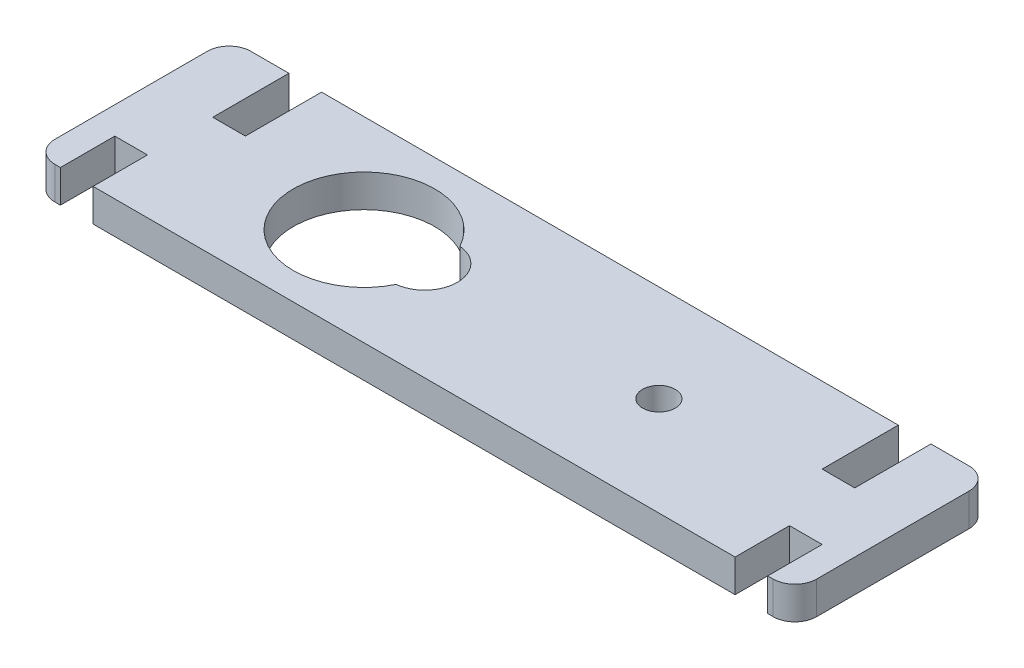
ISO-10303-21;
HEADER;
FILE_DESCRIPTION(('STEP AP214'),'2;1');
FILE_NAME('part.step','',(''),(''),'','','');
FILE_SCHEMA(('AUTOMOTIVE_DESIGN { 1 0 10303 214 1 1 1 1 }'));
ENDSEC;
DATA;
#1=APPLICATION_CONTEXT('core data for automotive mechanical design processes');
#2=APPLICATION_PROTOCOL_DEFINITION('international standard','automotive_design',2000,#1);
#3=PRODUCT_CONTEXT('',#1,'mechanical');
#4=PRODUCT('Part','Part','',(#3));
#5=PRODUCT_RELATED_PRODUCT_CATEGORY('part','',(#4));
#6=PRODUCT_DEFINITION_FORMATION('','',#4);
#7=PRODUCT_DEFINITION_CONTEXT('part definition',#1,'design');
#8=PRODUCT_DEFINITION('design','',#6,#7);
#9=PRODUCT_DEFINITION_SHAPE('','',#8);
#10=(LENGTH_UNIT() NAMED_UNIT(*) SI_UNIT(.MILLI.,.METRE.));
#11=(NAMED_UNIT(*) PLANE_ANGLE_UNIT() SI_UNIT($,.RADIAN.));
#12=(NAMED_UNIT(*) SI_UNIT($,.STERADIAN.) SOLID_ANGLE_UNIT());
#13=UNCERTAINTY_MEASURE_WITH_UNIT(LENGTH_MEASURE(1.E-05),#10,'distance_accuracy_value','');
#14=(GEOMETRIC_REPRESENTATION_CONTEXT(3) GLOBAL_UNCERTAINTY_ASSIGNED_CONTEXT((#13)) GLOBAL_UNIT_ASSIGNED_CONTEXT((#10,
#11,#12)) REPRESENTATION_CONTEXT('',''));
#15=CARTESIAN_POINT('',(0.,0.,0.));
#16=DIRECTION('',(0.,0.,1.));
#17=DIRECTION('',(1.,0.,0.));
#18=AXIS2_PLACEMENT_3D('',#15,#16,#17);
#19=CARTESIAN_POINT('',(62.4161145926589,3.,2.12292688749626));
#20=DIRECTION('',(0.,0.,-1.));
#21=DIRECTION('',(-1.,0.,0.));
#22=AXIS2_PLACEMENT_3D('',#19,#20,#21);
#23=PLANE('',#22);
#24=DIRECTION('',(1.,0.,0.));
#25=VECTOR('',#24,1.);
#26=CARTESIAN_POINT('',(62.4161145926589,0.,2.12292688749626));
#27=LINE('',#26,#25);
#28=CARTESIAN_POINT('',(-0.0838854073410972,0.,2.12292688749627));
#29=VERTEX_POINT('',#28);
#30=CARTESIAN_POINT('',(58.9161145926589,0.,2.12292688749627));
#31=VERTEX_POINT('',#30);
#32=EDGE_CURVE('E233',#29,#31,#27,.T.);
#33=ORIENTED_EDGE('',*,*,#32,.T.);
#34=DIRECTION('',(0.,1.,0.));
#35=VECTOR('',#34,1.);
#36=CARTESIAN_POINT('',(58.9161145926589,0.,2.12292688749627));
#37=LINE('',#36,#35);
#38=CARTESIAN_POINT('',(58.9161145926589,3.,2.12292688749627));
#39=VERTEX_POINT('',#38);
#40=EDGE_CURVE('E216',#31,#39,#37,.T.);
#41=ORIENTED_EDGE('',*,*,#40,.T.);
#42=DIRECTION('',(1.,0.,0.));
#43=VECTOR('',#42,1.);
#44=CARTESIAN_POINT('',(62.4161145926589,3.,2.12292688749626));
#45=LINE('',#44,#43);
#46=CARTESIAN_POINT('',(-0.0838854073410972,3.,2.12292688749627));
#47=VERTEX_POINT('',#46);
#48=EDGE_CURVE('E319',#47,#39,#45,.T.);
#49=ORIENTED_EDGE('',*,*,#48,.F.);
#50=DIRECTION('',(0.,1.,0.));
#51=VECTOR('',#50,1.);
#52=CARTESIAN_POINT('',(-0.0838854073410972,0.,2.12292688749627));
#53=LINE('',#52,#51);
#54=EDGE_CURVE('E239',#29,#47,#53,.T.);
#55=ORIENTED_EDGE('',*,*,#54,.F.);
#56=EDGE_LOOP('',(#33,#41,#49,#55));
#57=FACE_BOUND('',#56,.T.);
#58=ADVANCED_FACE('F43',(#57),#23,.F.);
#59=CARTESIAN_POINT('',(61.9161145926589,3.,2.12292688749627));
#60=VERTEX_POINT('',#59);
#61=CARTESIAN_POINT('',(62.4161145926589,3.,2.12292688749626));
#62=VERTEX_POINT('',#61);
#63=EDGE_CURVE('E314',#60,#62,#45,.T.);
#64=ORIENTED_EDGE('',*,*,#63,.F.);
#65=DIRECTION('',(0.,1.,0.));
#66=VECTOR('',#65,1.);
#67=CARTESIAN_POINT('',(61.9161145926589,0.,2.12292688749627));
#68=LINE('',#67,#66);
#69=CARTESIAN_POINT('',(61.9161145926589,0.,2.12292688749627));
#70=VERTEX_POINT('',#69);
#71=EDGE_CURVE('E226',#70,#60,#68,.T.);
#72=ORIENTED_EDGE('',*,*,#71,.F.);
#73=CARTESIAN_POINT('',(62.4161145926589,0.,2.12292688749626));
#74=VERTEX_POINT('',#73);
#75=EDGE_CURVE('E241',#70,#74,#27,.T.);
#76=ORIENTED_EDGE('',*,*,#75,.T.);
#77=DIRECTION('',(0.,-1.,0.));
#78=VECTOR('',#77,1.);
#79=CARTESIAN_POINT('',(62.4161145926589,3.,2.12292688749626));
#80=LINE('',#79,#78);
#81=EDGE_CURVE('E273',#62,#74,#80,.T.);
#82=ORIENTED_EDGE('',*,*,#81,.F.);
#83=EDGE_LOOP('',(#64,#72,#76,#82));
#84=FACE_BOUND('',#83,.T.);
#85=ADVANCED_FACE('F433',(#84),#23,.F.);
#86=CARTESIAN_POINT('',(-3.58388540734109,3.,-15.8770731125037));
#87=DIRECTION('',(0.,0.,1.));
#88=DIRECTION('',(1.,0.,0.));
#89=AXIS2_PLACEMENT_3D('',#86,#87,#88);
#90=PLANE('',#89);
#91=DIRECTION('',(-1.,0.,0.));
#92=VECTOR('',#91,1.);
#93=CARTESIAN_POINT('',(-3.58388540734109,3.,-15.8770731125037));
#94=LINE('',#93,#92);
#95=CARTESIAN_POINT('',(-0.0838854073410972,3.,-15.8770731125037));
#96=VERTEX_POINT('',#95);
#97=CARTESIAN_POINT('',(-3.58388540734109,3.,-15.8770731125037));
#98=VERTEX_POINT('',#97);
#99=EDGE_CURVE('E325',#96,#98,#94,.T.);
#100=ORIENTED_EDGE('',*,*,#99,.F.);
#101=DIRECTION('',(0.,1.,0.));
#102=VECTOR('',#101,1.);
#103=CARTESIAN_POINT('',(-0.0838854073410972,0.,-15.8770731125037));
#104=LINE('',#103,#102);
#105=CARTESIAN_POINT('',(-0.0838854073410972,0.,-15.8770731125037));
#106=VERTEX_POINT('',#105);
#107=EDGE_CURVE('E374',#106,#96,#104,.T.);
#108=ORIENTED_EDGE('',*,*,#107,.F.);
#109=DIRECTION('',(-1.,0.,0.));
#110=VECTOR('',#109,1.);
#111=CARTESIAN_POINT('',(-3.58388540734109,0.,-15.8770731125037));
#112=LINE('',#111,#110);
#113=CARTESIAN_POINT('',(-3.58388540734109,0.,-15.8770731125037));
#114=VERTEX_POINT('',#113);
#115=EDGE_CURVE('E254',#106,#114,#112,.T.);
#116=ORIENTED_EDGE('',*,*,#115,.T.);
#117=DIRECTION('',(0.,-1.,0.));
#118=VECTOR('',#117,1.);
#119=CARTESIAN_POINT('',(-3.58388540734109,3.,-15.8770731125037));
#120=LINE('',#119,#118);
#121=EDGE_CURVE('E260',#98,#114,#120,.T.);
#122=ORIENTED_EDGE('',*,*,#121,.F.);
#123=EDGE_LOOP('',(#100,#108,#116,#122));
#124=FACE_BOUND('',#123,.T.);
#125=ADVANCED_FACE('F439',(#124),#90,.F.);
#126=CARTESIAN_POINT('',(55.9161145926589,0.,-15.8770731125037));
#127=VERTEX_POINT('',#126);
#128=CARTESIAN_POINT('',(2.91611459265891,0.,-15.8770731125037));
#129=VERTEX_POINT('',#128);
#130=EDGE_CURVE('E259',#127,#129,#112,.T.);
#131=ORIENTED_EDGE('',*,*,#130,.T.);
#132=DIRECTION('',(0.,1.,0.));
#133=VECTOR('',#132,1.);
#134=CARTESIAN_POINT('',(2.91611459265891,0.,-15.8770731125037));
#135=LINE('',#134,#133);
#136=CARTESIAN_POINT('',(2.91611459265891,3.,-15.8770731125037));
#137=VERTEX_POINT('',#136);
#138=EDGE_CURVE('E376',#129,#137,#135,.T.);
#139=ORIENTED_EDGE('',*,*,#138,.T.);
#140=CARTESIAN_POINT('',(55.9161145926589,3.,-15.8770731125037));
#141=VERTEX_POINT('',#140);
#142=EDGE_CURVE('E327',#141,#137,#94,.T.);
#143=ORIENTED_EDGE('',*,*,#142,.F.);
#144=DIRECTION('',(0.,1.,0.));
#145=VECTOR('',#144,1.);
#146=CARTESIAN_POINT('',(55.9161145926589,0.,-15.8770731125037));
#147=LINE('',#146,#145);
#148=EDGE_CURVE('E390',#127,#141,#147,.T.);
#149=ORIENTED_EDGE('',*,*,#148,.F.);
#150=EDGE_LOOP('',(#131,#139,#143,#149));
#151=FACE_BOUND('',#150,.T.);
#152=ADVANCED_FACE('F459',(#151),#90,.F.);
#153=CARTESIAN_POINT('',(-3.58388540734109,3.,-13.8770731125037));
#154=DIRECTION('',(0.,-1.,0.));
#155=DIRECTION('',(0.,0.,-1.));
#156=AXIS2_PLACEMENT_3D('',#153,#154,#155);
#157=CYLINDRICAL_SURFACE('',#156,2.);
#158=CARTESIAN_POINT('',(-3.58388540734109,0.,-13.8770731125037));
#159=DIRECTION('',(0.,1.,0.));
#160=DIRECTION('',(0.,0.,-1.));
#161=AXIS2_PLACEMENT_3D('',#158,#159,#160);
#162=CIRCLE('',#161,2.);
#163=CARTESIAN_POINT('',(-5.58388540734109,0.,-13.8770731125037));
#164=VERTEX_POINT('',#163);
#165=EDGE_CURVE('E298',#114,#164,#162,.T.);
#166=ORIENTED_EDGE('',*,*,#165,.T.);
#167=DIRECTION('',(0.,-1.,0.));
#168=VECTOR('',#167,1.);
#169=CARTESIAN_POINT('',(-5.58388540734109,3.,-13.8770731125037));
#170=LINE('',#169,#168);
#171=CARTESIAN_POINT('',(-5.58388540734109,3.,-13.8770731125037));
#172=VERTEX_POINT('',#171);
#173=EDGE_CURVE('E282',#172,#164,#170,.T.);
#174=ORIENTED_EDGE('',*,*,#173,.F.);
#175=CARTESIAN_POINT('',(-3.58388540734109,3.,-13.8770731125037));
#176=DIRECTION('',(0.,1.,0.));
#177=DIRECTION('',(0.,0.,-1.));
#178=AXIS2_PLACEMENT_3D('',#175,#176,#177);
#179=CIRCLE('',#178,2.);
#180=EDGE_CURVE('E258',#98,#172,#179,.T.);
#181=ORIENTED_EDGE('',*,*,#180,.F.);
#182=ORIENTED_EDGE('',*,*,#121,.T.);
#183=EDGE_LOOP('',(#166,#174,#181,#182));
#184=FACE_BOUND('',#183,.T.);
#185=ADVANCED_FACE('F45',(#184),#157,.T.);
#186=CARTESIAN_POINT('',(-5.58388540734109,3.,0.122926887496269));
#187=DIRECTION('',(1.,0.,0.));
#188=DIRECTION('',(0.,0.,-1.));
#189=AXIS2_PLACEMENT_3D('',#186,#187,#188);
#190=PLANE('',#189);
#191=DIRECTION('',(0.,0.,1.));
#192=VECTOR('',#191,1.);
#193=CARTESIAN_POINT('',(-5.58388540734109,0.,0.122926887496269));
#194=LINE('',#193,#192);
#195=CARTESIAN_POINT('',(-5.58388540734109,0.,0.122926887496269));
#196=VERTEX_POINT('',#195);
#197=EDGE_CURVE('E301',#164,#196,#194,.T.);
#198=ORIENTED_EDGE('',*,*,#197,.T.);
#199=DIRECTION('',(0.,-1.,0.));
#200=VECTOR('',#199,1.);
#201=CARTESIAN_POINT('',(-5.58388540734109,3.,0.122926887496269));
#202=LINE('',#201,#200);
#203=CARTESIAN_POINT('',(-5.58388540734109,3.,0.122926887496269));
#204=VERTEX_POINT('',#203);
#205=EDGE_CURVE('E279',#204,#196,#202,.T.);
#206=ORIENTED_EDGE('',*,*,#205,.F.);
#207=DIRECTION('',(0.,0.,1.));
#208=VECTOR('',#207,1.);
#209=CARTESIAN_POINT('',(-5.58388540734109,3.,0.122926887496269));
#210=LINE('',#209,#208);
#211=EDGE_CURVE('E310',#172,#204,#210,.T.);
#212=ORIENTED_EDGE('',*,*,#211,.F.);
#213=ORIENTED_EDGE('',*,*,#173,.T.);
#214=EDGE_LOOP('',(#198,#206,#212,#213));
#215=FACE_BOUND('',#214,.T.);
#216=ADVANCED_FACE('F452',(#215),#190,.F.);
#217=CARTESIAN_POINT('',(-3.58388540734109,3.,0.122926887496269));
#218=DIRECTION('',(0.,-1.,0.));
#219=DIRECTION('',(0.,0.,-1.));
#220=AXIS2_PLACEMENT_3D('',#217,#218,#219);
#221=CYLINDRICAL_SURFACE('',#220,2.);
#222=CARTESIAN_POINT('',(-3.58388540734109,0.,0.122926887496269));
#223=DIRECTION('',(0.,1.,0.));
#224=DIRECTION('',(0.,0.,-1.));
#225=AXIS2_PLACEMENT_3D('',#222,#223,#224);
#226=CIRCLE('',#225,2.);
#227=CARTESIAN_POINT('',(-3.58388540734109,0.,2.12292688749627));
#228=VERTEX_POINT('',#227);
#229=EDGE_CURVE('E245',#196,#228,#226,.T.);
#230=ORIENTED_EDGE('',*,*,#229,.T.);
#231=DIRECTION('',(0.,-1.,0.));
#232=VECTOR('',#231,1.);
#233=CARTESIAN_POINT('',(-3.58388540734109,3.,2.12292688749627));
#234=LINE('',#233,#232);
#235=CARTESIAN_POINT('',(-3.58388540734109,3.,2.12292688749627));
#236=VERTEX_POINT('',#235);
#237=EDGE_CURVE('E276',#236,#228,#234,.T.);
#238=ORIENTED_EDGE('',*,*,#237,.F.);
#239=CARTESIAN_POINT('',(-3.58388540734109,3.,0.122926887496269));
#240=DIRECTION('',(0.,1.,0.));
#241=DIRECTION('',(0.,0.,-1.));
#242=AXIS2_PLACEMENT_3D('',#239,#240,#241);
#243=CIRCLE('',#242,2.);
#244=EDGE_CURVE('E312',#204,#236,#243,.T.);
#245=ORIENTED_EDGE('',*,*,#244,.F.);
#246=ORIENTED_EDGE('',*,*,#205,.T.);
#247=EDGE_LOOP('',(#230,#238,#245,#246));
#248=FACE_BOUND('',#247,.T.);
#249=ADVANCED_FACE('F333',(#248),#221,.T.);
#250=CARTESIAN_POINT('',(-3.0838854073411,0.,2.12292688749627));
#251=VERTEX_POINT('',#250);
#252=EDGE_CURVE('E240',#228,#251,#27,.T.);
#253=ORIENTED_EDGE('',*,*,#252,.T.);
#254=DIRECTION('',(0.,1.,0.));
#255=VECTOR('',#254,1.);
#256=CARTESIAN_POINT('',(-3.0838854073411,0.,2.12292688749627));
#257=LINE('',#256,#255);
#258=CARTESIAN_POINT('',(-3.0838854073411,3.,2.12292688749627));
#259=VERTEX_POINT('',#258);
#260=EDGE_CURVE('E533',#251,#259,#257,.T.);
#261=ORIENTED_EDGE('',*,*,#260,.T.);
#262=EDGE_CURVE('E315',#236,#259,#45,.T.);
#263=ORIENTED_EDGE('',*,*,#262,.F.);
#264=ORIENTED_EDGE('',*,*,#237,.T.);
#265=EDGE_LOOP('',(#253,#261,#263,#264));
#266=FACE_BOUND('',#265,.T.);
#267=ADVANCED_FACE('F338',(#266),#23,.F.);
#268=CARTESIAN_POINT('',(62.4161145926589,3.,0.12292688749626));
#269=DIRECTION('',(0.,-1.,0.));
#270=DIRECTION('',(0.,0.,-1.));
#271=AXIS2_PLACEMENT_3D('',#268,#269,#270);
#272=CYLINDRICAL_SURFACE('',#271,2.);
#273=CARTESIAN_POINT('',(62.4161145926589,0.,0.12292688749626));
#274=DIRECTION('',(0.,1.,0.));
#275=DIRECTION('',(0.,0.,-1.));
#276=AXIS2_PLACEMENT_3D('',#273,#274,#275);
#277=CIRCLE('',#276,2.);
#278=CARTESIAN_POINT('',(64.4161145926589,0.,0.12292688749626));
#279=VERTEX_POINT('',#278);
#280=EDGE_CURVE('E244',#74,#279,#277,.T.);
#281=ORIENTED_EDGE('',*,*,#280,.T.);
#282=DIRECTION('',(0.,-1.,0.));
#283=VECTOR('',#282,1.);
#284=CARTESIAN_POINT('',(64.4161145926589,3.,0.12292688749626));
#285=LINE('',#284,#283);
#286=CARTESIAN_POINT('',(64.4161145926589,3.,0.12292688749626));
#287=VERTEX_POINT('',#286);
#288=EDGE_CURVE('E270',#287,#279,#285,.T.);
#289=ORIENTED_EDGE('',*,*,#288,.F.);
#290=CARTESIAN_POINT('',(62.4161145926589,3.,0.12292688749626));
#291=DIRECTION('',(0.,1.,0.));
#292=DIRECTION('',(0.,0.,-1.));
#293=AXIS2_PLACEMENT_3D('',#290,#291,#292);
#294=CIRCLE('',#293,2.);
#295=EDGE_CURVE('E318',#62,#287,#294,.T.);
#296=ORIENTED_EDGE('',*,*,#295,.F.);
#297=ORIENTED_EDGE('',*,*,#81,.T.);
#298=EDGE_LOOP('',(#281,#289,#296,#297));
#299=FACE_BOUND('',#298,.T.);
#300=ADVANCED_FACE('F444',(#299),#272,.T.);
#301=CARTESIAN_POINT('',(64.4161145926589,3.,-13.8770731125037));
#302=DIRECTION('',(-1.,0.,0.));
#303=DIRECTION('',(0.,0.,1.));
#304=AXIS2_PLACEMENT_3D('',#301,#302,#303);
#305=PLANE('',#304);
#306=DIRECTION('',(0.,0.,-1.));
#307=VECTOR('',#306,1.);
#308=CARTESIAN_POINT('',(64.4161145926589,0.,-13.8770731125037));
#309=LINE('',#308,#307);
#310=CARTESIAN_POINT('',(64.4161145926589,0.,-13.8770731125037));
#311=VERTEX_POINT('',#310);
#312=EDGE_CURVE('E250',#279,#311,#309,.T.);
#313=ORIENTED_EDGE('',*,*,#312,.T.);
#314=DIRECTION('',(0.,-1.,0.));
#315=VECTOR('',#314,1.);
#316=CARTESIAN_POINT('',(64.4161145926589,3.,-13.8770731125037));
#317=LINE('',#316,#315);
#318=CARTESIAN_POINT('',(64.4161145926589,3.,-13.8770731125037));
#319=VERTEX_POINT('',#318);
#320=EDGE_CURVE('E267',#319,#311,#317,.T.);
#321=ORIENTED_EDGE('',*,*,#320,.F.);
#322=DIRECTION('',(0.,0.,-1.));
#323=VECTOR('',#322,1.);
#324=CARTESIAN_POINT('',(64.4161145926589,3.,-13.8770731125037));
#325=LINE('',#324,#323);
#326=EDGE_CURVE('E321',#287,#319,#325,.T.);
#327=ORIENTED_EDGE('',*,*,#326,.F.);
#328=ORIENTED_EDGE('',*,*,#288,.T.);
#329=EDGE_LOOP('',(#313,#321,#327,#328));
#330=FACE_BOUND('',#329,.T.);
#331=ADVANCED_FACE('F449',(#330),#305,.F.);
#332=CARTESIAN_POINT('',(62.4161145926589,3.,-13.8770731125037));
#333=DIRECTION('',(0.,-1.,0.));
#334=DIRECTION('',(0.,0.,-1.));
#335=AXIS2_PLACEMENT_3D('',#332,#333,#334);
#336=CYLINDRICAL_SURFACE('',#335,2.);
#337=CARTESIAN_POINT('',(62.4161145926589,0.,-13.8770731125037));
#338=DIRECTION('',(0.,1.,0.));
#339=DIRECTION('',(0.,0.,-1.));
#340=AXIS2_PLACEMENT_3D('',#337,#338,#339);
#341=CIRCLE('',#340,2.);
#342=CARTESIAN_POINT('',(62.4161145926589,0.,-15.8770731125037));
#343=VERTEX_POINT('',#342);
#344=EDGE_CURVE('E252',#311,#343,#341,.T.);
#345=ORIENTED_EDGE('',*,*,#344,.T.);
#346=DIRECTION('',(0.,-1.,0.));
#347=VECTOR('',#346,1.);
#348=CARTESIAN_POINT('',(62.4161145926589,3.,-15.8770731125037));
#349=LINE('',#348,#347);
#350=CARTESIAN_POINT('',(62.4161145926589,3.,-15.8770731125037));
#351=VERTEX_POINT('',#350);
#352=EDGE_CURVE('E263',#351,#343,#349,.T.);
#353=ORIENTED_EDGE('',*,*,#352,.F.);
#354=CARTESIAN_POINT('',(62.4161145926589,3.,-13.8770731125037));
#355=DIRECTION('',(0.,1.,0.));
#356=DIRECTION('',(0.,0.,-1.));
#357=AXIS2_PLACEMENT_3D('',#354,#355,#356);
#358=CIRCLE('',#357,2.);
#359=EDGE_CURVE('E323',#319,#351,#358,.T.);
#360=ORIENTED_EDGE('',*,*,#359,.F.);
#361=ORIENTED_EDGE('',*,*,#320,.T.);
#362=EDGE_LOOP('',(#345,#353,#360,#361));
#363=FACE_BOUND('',#362,.T.);
#364=ADVANCED_FACE('F506',(#363),#336,.T.);
#365=CARTESIAN_POINT('',(58.9161145926589,0.,-15.8770731125037));
#366=VERTEX_POINT('',#365);
#367=EDGE_CURVE('E255',#343,#366,#112,.T.);
#368=ORIENTED_EDGE('',*,*,#367,.T.);
#369=DIRECTION('',(0.,1.,0.));
#370=VECTOR('',#369,1.);
#371=CARTESIAN_POINT('',(58.9161145926589,0.,-15.8770731125037));
#372=LINE('',#371,#370);
#373=CARTESIAN_POINT('',(58.9161145926589,3.,-15.8770731125037));
#374=VERTEX_POINT('',#373);
#375=EDGE_CURVE('E387',#366,#374,#372,.T.);
#376=ORIENTED_EDGE('',*,*,#375,.T.);
#377=EDGE_CURVE('E264',#351,#374,#94,.T.);
#378=ORIENTED_EDGE('',*,*,#377,.F.);
#379=ORIENTED_EDGE('',*,*,#352,.T.);
#380=EDGE_LOOP('',(#368,#376,#378,#379));
#381=FACE_BOUND('',#380,.T.);
#382=ADVANCED_FACE('F466',(#381),#90,.F.);
#383=CARTESIAN_POINT('',(-3.58388540734109,3.,-13.8770731125037));
#384=DIRECTION('',(0.,-1.,0.));
#385=DIRECTION('',(0.,0.,-1.));
#386=AXIS2_PLACEMENT_3D('',#383,#384,#385);
#387=PLANE('',#386);
#388=CARTESIAN_POINT('',(42.8161145926589,3.,-6.97707311250373));
#389=DIRECTION('',(0.,1.,0.));
#390=DIRECTION('',(0.,0.,1.));
#391=AXIS2_PLACEMENT_3D('',#388,#389,#390);
#392=CIRCLE('',#391,1.5);
#393=CARTESIAN_POINT('',(42.8161145926589,3.,-5.47707311250372));
#394=VERTEX_POINT('',#393);
#395=EDGE_CURVE('E410',#394,#394,#392,.T.);
#396=ORIENTED_EDGE('',*,*,#395,.F.);
#397=EDGE_LOOP('',(#396));
#398=FACE_BOUND('',#397,.T.);
#399=CARTESIAN_POINT('',(15.8161145926589,3.,-6.87707311250373));
#400=DIRECTION('',(0.,1.,0.));
#401=DIRECTION('',(0.,0.,1.));
#402=AXIS2_PLACEMENT_3D('',#399,#400,#401);
#403=CIRCLE('',#402,6.5);
#404=CARTESIAN_POINT('',(21.5343897291042,3.,-9.96759563530003));
#405=VERTEX_POINT('',#404);
#406=CARTESIAN_POINT('',(21.6433379182847,3.,-3.99723486821237));
#407=VERTEX_POINT('',#406);
#408=EDGE_CURVE('E292',#405,#407,#403,.T.);
#409=ORIENTED_EDGE('',*,*,#408,.F.);
#410=CARTESIAN_POINT('',(21.2961145926589,3.,-6.97707311250373));
#411=DIRECTION('',(0.,1.,0.));
#412=DIRECTION('',(0.,0.,1.));
#413=AXIS2_PLACEMENT_3D('',#410,#411,#412);
#414=CIRCLE('',#413,3.);
#415=EDGE_CURVE('E409',#407,#405,#414,.T.);
#416=ORIENTED_EDGE('',*,*,#415,.F.);
#417=EDGE_LOOP('',(#409,#416));
#418=FACE_BOUND('',#417,.T.);
#419=ORIENTED_EDGE('',*,*,#48,.T.);
#420=DIRECTION('',(0.,0.,1.));
#421=VECTOR('',#420,1.);
#422=CARTESIAN_POINT('',(58.9161145926589,3.,2.12292688749627));
#423=LINE('',#422,#421);
#424=CARTESIAN_POINT('',(58.9161145926589,3.,-2.87707311250373));
#425=VERTEX_POINT('',#424);
#426=EDGE_CURVE('E221',#425,#39,#423,.T.);
#427=ORIENTED_EDGE('',*,*,#426,.F.);
#428=DIRECTION('',(-1.,0.,0.));
#429=VECTOR('',#428,1.);
#430=CARTESIAN_POINT('',(58.9161145926589,3.,-2.87707311250373));
#431=LINE('',#430,#429);
#432=CARTESIAN_POINT('',(61.9161145926589,3.,-2.87707311250373));
#433=VERTEX_POINT('',#432);
#434=EDGE_CURVE('E236',#433,#425,#431,.T.);
#435=ORIENTED_EDGE('',*,*,#434,.F.);
#436=DIRECTION('',(0.,0.,-1.));
#437=VECTOR('',#436,1.);
#438=CARTESIAN_POINT('',(61.9161145926589,3.,2.12292688749627));
#439=LINE('',#438,#437);
#440=EDGE_CURVE('E523',#60,#433,#439,.T.);
#441=ORIENTED_EDGE('',*,*,#440,.F.);
#442=ORIENTED_EDGE('',*,*,#63,.T.);
#443=ORIENTED_EDGE('',*,*,#295,.T.);
#444=ORIENTED_EDGE('',*,*,#326,.T.);
#445=ORIENTED_EDGE('',*,*,#359,.T.);
#446=ORIENTED_EDGE('',*,*,#377,.T.);
#447=DIRECTION('',(0.,0.,-1.));
#448=VECTOR('',#447,1.);
#449=CARTESIAN_POINT('',(58.9161145926589,3.,-15.8770731125037));
#450=LINE('',#449,#448);
#451=CARTESIAN_POINT('',(58.9161145926589,3.,-8.87707311250372));
#452=VERTEX_POINT('',#451);
#453=EDGE_CURVE('E393',#452,#374,#450,.T.);
#454=ORIENTED_EDGE('',*,*,#453,.F.);
#455=DIRECTION('',(1.,0.,0.));
#456=VECTOR('',#455,1.);
#457=CARTESIAN_POINT('',(55.9161145926589,3.,-8.87707311250372));
#458=LINE('',#457,#456);
#459=CARTESIAN_POINT('',(55.9161145926589,3.,-8.87707311250372));
#460=VERTEX_POINT('',#459);
#461=EDGE_CURVE('E395',#460,#452,#458,.T.);
#462=ORIENTED_EDGE('',*,*,#461,.F.);
#463=DIRECTION('',(0.,0.,1.));
#464=VECTOR('',#463,1.);
#465=CARTESIAN_POINT('',(55.9161145926589,3.,-15.8770731125037));
#466=LINE('',#465,#464);
#467=EDGE_CURVE('E370',#141,#460,#466,.T.);
#468=ORIENTED_EDGE('',*,*,#467,.F.);
#469=ORIENTED_EDGE('',*,*,#142,.T.);
#470=DIRECTION('',(0.,0.,-1.));
#471=VECTOR('',#470,1.);
#472=CARTESIAN_POINT('',(2.91611459265891,3.,-15.8770731125037));
#473=LINE('',#472,#471);
#474=CARTESIAN_POINT('',(2.91611459265891,3.,-8.87707311250372));
#475=VERTEX_POINT('',#474);
#476=EDGE_CURVE('E359',#475,#137,#473,.T.);
#477=ORIENTED_EDGE('',*,*,#476,.F.);
#478=DIRECTION('',(1.,0.,0.));
#479=VECTOR('',#478,1.);
#480=CARTESIAN_POINT('',(-0.0838854073410928,3.,-8.87707311250372));
#481=LINE('',#480,#479);
#482=CARTESIAN_POINT('',(-0.0838854073410928,3.,-8.87707311250372));
#483=VERTEX_POINT('',#482);
#484=EDGE_CURVE('E369',#483,#475,#481,.T.);
#485=ORIENTED_EDGE('',*,*,#484,.F.);
#486=DIRECTION('',(0.,0.,1.));
#487=VECTOR('',#486,1.);
#488=CARTESIAN_POINT('',(-0.0838854073410972,3.,-15.8770731125037));
#489=LINE('',#488,#487);
#490=EDGE_CURVE('E366',#96,#483,#489,.T.);
#491=ORIENTED_EDGE('',*,*,#490,.F.);
#492=ORIENTED_EDGE('',*,*,#99,.T.);
#493=ORIENTED_EDGE('',*,*,#180,.T.);
#494=ORIENTED_EDGE('',*,*,#211,.T.);
#495=ORIENTED_EDGE('',*,*,#244,.T.);
#496=ORIENTED_EDGE('',*,*,#262,.T.);
#497=DIRECTION('',(0.,0.,1.));
#498=VECTOR('',#497,1.);
#499=CARTESIAN_POINT('',(-3.0838854073411,3.,2.12292688749627));
#500=LINE('',#499,#498);
#501=CARTESIAN_POINT('',(-3.0838854073411,3.,-2.87707311250374));
#502=VERTEX_POINT('',#501);
#503=EDGE_CURVE('E354',#502,#259,#500,.T.);
#504=ORIENTED_EDGE('',*,*,#503,.F.);
#505=DIRECTION('',(-1.,0.,0.));
#506=VECTOR('',#505,1.);
#507=CARTESIAN_POINT('',(-0.0838854073410972,3.,-2.87707311250374));
#508=LINE('',#507,#506);
#509=CARTESIAN_POINT('',(-0.0838854073410972,3.,-2.87707311250374));
#510=VERTEX_POINT('',#509);
#511=EDGE_CURVE('E536',#510,#502,#508,.T.);
#512=ORIENTED_EDGE('',*,*,#511,.F.);
#513=DIRECTION('',(0.,0.,-1.));
#514=VECTOR('',#513,1.);
#515=CARTESIAN_POINT('',(-0.0838854073410972,3.,2.12292688749627));
#516=LINE('',#515,#514);
#517=EDGE_CURVE('E350',#47,#510,#516,.T.);
#518=ORIENTED_EDGE('',*,*,#517,.F.);
#519=EDGE_LOOP('',(#419,#427,#435,#441,#442,#443,#444,#445,#446,#454,#462,#468,#469,#477,#485,
#491,#492,#493,#494,#495,#496,#504,#512,#518));
#520=FACE_BOUND('',#519,.T.);
#521=ADVANCED_FACE('F473',(#398,#418,#520),#387,.F.);
#522=CARTESIAN_POINT('',(-3.58388540734109,0.,-13.8770731125037));
#523=DIRECTION('',(0.,-1.,0.));
#524=DIRECTION('',(0.,0.,-1.));
#525=AXIS2_PLACEMENT_3D('',#522,#523,#524);
#526=PLANE('',#525);
#527=DIRECTION('',(0.,0.,1.));
#528=VECTOR('',#527,1.);
#529=CARTESIAN_POINT('',(58.9161145926589,0.,2.12292688749627));
#530=LINE('',#529,#528);
#531=CARTESIAN_POINT('',(58.9161145926589,0.,-2.87707311250373));
#532=VERTEX_POINT('',#531);
#533=EDGE_CURVE('E219',#532,#31,#530,.T.);
#534=ORIENTED_EDGE('',*,*,#533,.T.);
#535=ORIENTED_EDGE('',*,*,#32,.F.);
#536=DIRECTION('',(0.,0.,-1.));
#537=VECTOR('',#536,1.);
#538=CARTESIAN_POINT('',(-0.0838854073410972,0.,2.12292688749627));
#539=LINE('',#538,#537);
#540=CARTESIAN_POINT('',(-0.0838854073410972,0.,-2.87707311250374));
#541=VERTEX_POINT('',#540);
#542=EDGE_CURVE('E345',#29,#541,#539,.T.);
#543=ORIENTED_EDGE('',*,*,#542,.T.);
#544=DIRECTION('',(-1.,0.,0.));
#545=VECTOR('',#544,1.);
#546=CARTESIAN_POINT('',(-0.0838854073410972,0.,-2.87707311250374));
#547=LINE('',#546,#545);
#548=CARTESIAN_POINT('',(-3.0838854073411,0.,-2.87707311250374));
#549=VERTEX_POINT('',#548);
#550=EDGE_CURVE('E342',#541,#549,#547,.T.);
#551=ORIENTED_EDGE('',*,*,#550,.T.);
#552=DIRECTION('',(0.,0.,1.));
#553=VECTOR('',#552,1.);
#554=CARTESIAN_POINT('',(-3.0838854073411,0.,2.12292688749627));
#555=LINE('',#554,#553);
#556=EDGE_CURVE('E66',#549,#251,#555,.T.);
#557=ORIENTED_EDGE('',*,*,#556,.T.);
#558=ORIENTED_EDGE('',*,*,#252,.F.);
#559=ORIENTED_EDGE('',*,*,#229,.F.);
#560=ORIENTED_EDGE('',*,*,#197,.F.);
#561=ORIENTED_EDGE('',*,*,#165,.F.);
#562=ORIENTED_EDGE('',*,*,#115,.F.);
#563=DIRECTION('',(0.,0.,1.));
#564=VECTOR('',#563,1.);
#565=CARTESIAN_POINT('',(-0.0838854073410972,0.,-15.8770731125037));
#566=LINE('',#565,#564);
#567=CARTESIAN_POINT('',(-0.0838854073410928,0.,-8.87707311250372));
#568=VERTEX_POINT('',#567);
#569=EDGE_CURVE('E355',#106,#568,#566,.T.);
#570=ORIENTED_EDGE('',*,*,#569,.T.);
#571=DIRECTION('',(1.,0.,0.));
#572=VECTOR('',#571,1.);
#573=CARTESIAN_POINT('',(-0.0838854073410928,0.,-8.87707311250372));
#574=LINE('',#573,#572);
#575=CARTESIAN_POINT('',(2.91611459265891,0.,-8.87707311250372));
#576=VERTEX_POINT('',#575);
#577=EDGE_CURVE('E358',#568,#576,#574,.T.);
#578=ORIENTED_EDGE('',*,*,#577,.T.);
#579=DIRECTION('',(0.,0.,-1.));
#580=VECTOR('',#579,1.);
#581=CARTESIAN_POINT('',(2.91611459265891,0.,-15.8770731125037));
#582=LINE('',#581,#580);
#583=EDGE_CURVE('E362',#576,#129,#582,.T.);
#584=ORIENTED_EDGE('',*,*,#583,.T.);
#585=ORIENTED_EDGE('',*,*,#130,.F.);
#586=DIRECTION('',(0.,0.,1.));
#587=VECTOR('',#586,1.);
#588=CARTESIAN_POINT('',(55.9161145926589,0.,-15.8770731125037));
#589=LINE('',#588,#587);
#590=CARTESIAN_POINT('',(55.9161145926589,0.,-8.87707311250372));
#591=VERTEX_POINT('',#590);
#592=EDGE_CURVE('E396',#127,#591,#589,.T.);
#593=ORIENTED_EDGE('',*,*,#592,.T.);
#594=DIRECTION('',(1.,0.,0.));
#595=VECTOR('',#594,1.);
#596=CARTESIAN_POINT('',(55.9161145926589,0.,-8.87707311250372));
#597=LINE('',#596,#595);
#598=CARTESIAN_POINT('',(58.9161145926589,0.,-8.87707311250372));
#599=VERTEX_POINT('',#598);
#600=EDGE_CURVE('E403',#591,#599,#597,.T.);
#601=ORIENTED_EDGE('',*,*,#600,.T.);
#602=DIRECTION('',(0.,0.,-1.));
#603=VECTOR('',#602,1.);
#604=CARTESIAN_POINT('',(58.9161145926589,0.,-15.8770731125037));
#605=LINE('',#604,#603);
#606=EDGE_CURVE('E384',#599,#366,#605,.T.);
#607=ORIENTED_EDGE('',*,*,#606,.T.);
#608=ORIENTED_EDGE('',*,*,#367,.F.);
#609=ORIENTED_EDGE('',*,*,#344,.F.);
#610=ORIENTED_EDGE('',*,*,#312,.F.);
#611=ORIENTED_EDGE('',*,*,#280,.F.);
#612=ORIENTED_EDGE('',*,*,#75,.F.);
#613=DIRECTION('',(0.,0.,-1.));
#614=VECTOR('',#613,1.);
#615=CARTESIAN_POINT('',(61.9161145926589,0.,2.12292688749627));
#616=LINE('',#615,#614);
#617=CARTESIAN_POINT('',(61.9161145926589,0.,-2.87707311250373));
#618=VERTEX_POINT('',#617);
#619=EDGE_CURVE('E235',#70,#618,#616,.T.);
#620=ORIENTED_EDGE('',*,*,#619,.T.);
#621=DIRECTION('',(-1.,0.,0.));
#622=VECTOR('',#621,1.);
#623=CARTESIAN_POINT('',(58.9161145926589,0.,-2.87707311250373));
#624=LINE('',#623,#622);
#625=EDGE_CURVE('E58',#618,#532,#624,.T.);
#626=ORIENTED_EDGE('',*,*,#625,.T.);
#627=EDGE_LOOP('',(#534,#535,#543,#551,#557,#558,#559,#560,#561,#562,#570,#578,#584,#585,#593,
#601,#607,#608,#609,#610,#611,#612,#620,#626));
#628=FACE_BOUND('',#627,.T.);
#629=CARTESIAN_POINT('',(21.2961145926589,0.,-6.97707311250373));
#630=DIRECTION('',(0.,1.,0.));
#631=DIRECTION('',(0.,0.,1.));
#632=AXIS2_PLACEMENT_3D('',#629,#630,#631);
#633=CIRCLE('',#632,3.);
#634=CARTESIAN_POINT('',(21.6433379182847,0.,-3.99723486821236));
#635=VERTEX_POINT('',#634);
#636=CARTESIAN_POINT('',(21.5343897291042,0.,-9.96759563530003));
#637=VERTEX_POINT('',#636);
#638=EDGE_CURVE('E297',#635,#637,#633,.T.);
#639=ORIENTED_EDGE('',*,*,#638,.T.);
#640=CARTESIAN_POINT('',(15.8161145926589,0.,-6.87707311250373));
#641=DIRECTION('',(0.,1.,0.));
#642=DIRECTION('',(0.,0.,1.));
#643=AXIS2_PLACEMENT_3D('',#640,#641,#642);
#644=CIRCLE('',#643,6.5);
#645=EDGE_CURVE('E290',#637,#635,#644,.T.);
#646=ORIENTED_EDGE('',*,*,#645,.T.);
#647=EDGE_LOOP('',(#639,#646));
#648=FACE_BOUND('',#647,.T.);
#649=CARTESIAN_POINT('',(42.8161145926589,0.,-6.97707311250373));
#650=DIRECTION('',(0.,1.,0.));
#651=DIRECTION('',(0.,0.,1.));
#652=AXIS2_PLACEMENT_3D('',#649,#650,#651);
#653=CIRCLE('',#652,1.5);
#654=CARTESIAN_POINT('',(42.8161145926589,0.,-5.47707311250372));
#655=VERTEX_POINT('',#654);
#656=EDGE_CURVE('E305',#655,#655,#653,.T.);
#657=ORIENTED_EDGE('',*,*,#656,.T.);
#658=EDGE_LOOP('',(#657));
#659=FACE_BOUND('',#658,.T.);
#660=ADVANCED_FACE('F230',(#628,#648,#659),#526,.T.);
#661=CARTESIAN_POINT('',(15.8161145926589,0.,-6.87707311250373));
#662=DIRECTION('',(0.,1.,0.));
#663=DIRECTION('',(0.,0.,1.));
#664=AXIS2_PLACEMENT_3D('',#661,#662,#663);
#665=CYLINDRICAL_SURFACE('',#664,6.5);
#666=ORIENTED_EDGE('',*,*,#645,.F.);
#667=DIRECTION('',(0.,1.,0.));
#668=VECTOR('',#667,1.);
#669=CARTESIAN_POINT('',(21.5343897291042,1.5,-9.96759563530003));
#670=LINE('',#669,#668);
#671=EDGE_CURVE('E11',#637,#405,#670,.T.);
#672=ORIENTED_EDGE('',*,*,#671,.T.);
#673=ORIENTED_EDGE('',*,*,#408,.T.);
#674=DIRECTION('',(0.,1.,0.));
#675=VECTOR('',#674,1.);
#676=CARTESIAN_POINT('',(21.6433379182847,1.5,-3.99723486821237));
#677=LINE('',#676,#675);
#678=EDGE_CURVE('E51',#407,#635,#677,.F.);
#679=ORIENTED_EDGE('',*,*,#678,.T.);
#680=EDGE_LOOP('',(#666,#672,#673,#679));
#681=FACE_BOUND('',#680,.T.);
#682=ADVANCED_FACE('F289',(#681),#665,.F.);
#683=CARTESIAN_POINT('',(21.2961145926589,0.,-6.97707311250373));
#684=DIRECTION('',(0.,1.,0.));
#685=DIRECTION('',(0.,0.,1.));
#686=AXIS2_PLACEMENT_3D('',#683,#684,#685);
#687=CYLINDRICAL_SURFACE('',#686,3.);
#688=ORIENTED_EDGE('',*,*,#638,.F.);
#689=ORIENTED_EDGE('',*,*,#678,.F.);
#690=ORIENTED_EDGE('',*,*,#415,.T.);
#691=ORIENTED_EDGE('',*,*,#671,.F.);
#692=EDGE_LOOP('',(#688,#689,#690,#691));
#693=FACE_BOUND('',#692,.T.);
#694=ADVANCED_FACE('F420',(#693),#687,.F.);
#695=CARTESIAN_POINT('',(42.8161145926589,0.,-6.97707311250373));
#696=DIRECTION('',(0.,1.,0.));
#697=DIRECTION('',(0.,0.,1.));
#698=AXIS2_PLACEMENT_3D('',#695,#696,#697);
#699=CYLINDRICAL_SURFACE('',#698,1.5);
#700=ORIENTED_EDGE('',*,*,#656,.F.);
#701=EDGE_LOOP('',(#700));
#702=FACE_BOUND('',#701,.T.);
#703=ORIENTED_EDGE('',*,*,#395,.T.);
#704=EDGE_LOOP('',(#703));
#705=FACE_BOUND('',#704,.T.);
#706=ADVANCED_FACE('F417',(#702,#705),#699,.F.);
#707=CARTESIAN_POINT('',(55.9161145926589,0.,-15.8770731125037));
#708=DIRECTION('',(-1.,0.,0.));
#709=DIRECTION('',(0.,0.,1.));
#710=AXIS2_PLACEMENT_3D('',#707,#708,#709);
#711=PLANE('',#710);
#712=ORIENTED_EDGE('',*,*,#467,.T.);
#713=DIRECTION('',(0.,1.,0.));
#714=VECTOR('',#713,1.);
#715=CARTESIAN_POINT('',(55.9161145926589,0.,-8.87707311250372));
#716=LINE('',#715,#714);
#717=EDGE_CURVE('E382',#591,#460,#716,.T.);
#718=ORIENTED_EDGE('',*,*,#717,.F.);
#719=ORIENTED_EDGE('',*,*,#592,.F.);
#720=ORIENTED_EDGE('',*,*,#148,.T.);
#721=EDGE_LOOP('',(#712,#718,#719,#720));
#722=FACE_BOUND('',#721,.T.);
#723=ADVANCED_FACE('F419',(#722),#711,.F.);
#724=CARTESIAN_POINT('',(58.9161145926589,0.,-15.8770731125037));
#725=DIRECTION('',(1.,0.,0.));
#726=DIRECTION('',(0.,0.,-1.));
#727=AXIS2_PLACEMENT_3D('',#724,#725,#726);
#728=PLANE('',#727);
#729=ORIENTED_EDGE('',*,*,#453,.T.);
#730=ORIENTED_EDGE('',*,*,#375,.F.);
#731=ORIENTED_EDGE('',*,*,#606,.F.);
#732=DIRECTION('',(0.,1.,0.));
#733=VECTOR('',#732,1.);
#734=CARTESIAN_POINT('',(58.9161145926589,0.,-8.87707311250372));
#735=LINE('',#734,#733);
#736=EDGE_CURVE('E385',#599,#452,#735,.T.);
#737=ORIENTED_EDGE('',*,*,#736,.T.);
#738=EDGE_LOOP('',(#729,#730,#731,#737));
#739=FACE_BOUND('',#738,.T.);
#740=ADVANCED_FACE('F427',(#739),#728,.F.);
#741=CARTESIAN_POINT('',(55.9161145926589,0.,-8.87707311250372));
#742=DIRECTION('',(0.,0.,1.));
#743=DIRECTION('',(1.,0.,0.));
#744=AXIS2_PLACEMENT_3D('',#741,#742,#743);
#745=PLANE('',#744);
#746=ORIENTED_EDGE('',*,*,#461,.T.);
#747=ORIENTED_EDGE('',*,*,#736,.F.);
#748=ORIENTED_EDGE('',*,*,#600,.F.);
#749=ORIENTED_EDGE('',*,*,#717,.T.);
#750=EDGE_LOOP('',(#746,#747,#748,#749));
#751=FACE_BOUND('',#750,.T.);
#752=ADVANCED_FACE('F497',(#751),#745,.F.);
#753=CARTESIAN_POINT('',(-0.0838854073410972,0.,-15.8770731125037));
#754=DIRECTION('',(-1.,0.,0.));
#755=DIRECTION('',(0.,0.,1.));
#756=AXIS2_PLACEMENT_3D('',#753,#754,#755);
#757=PLANE('',#756);
#758=ORIENTED_EDGE('',*,*,#490,.T.);
#759=DIRECTION('',(0.,1.,0.));
#760=VECTOR('',#759,1.);
#761=CARTESIAN_POINT('',(-0.0838854073410928,0.,-8.87707311250372));
#762=LINE('',#761,#760);
#763=EDGE_CURVE('E365',#568,#483,#762,.T.);
#764=ORIENTED_EDGE('',*,*,#763,.F.);
#765=ORIENTED_EDGE('',*,*,#569,.F.);
#766=ORIENTED_EDGE('',*,*,#107,.T.);
#767=EDGE_LOOP('',(#758,#764,#765,#766));
#768=FACE_BOUND('',#767,.T.);
#769=ADVANCED_FACE('F560',(#768),#757,.F.);
#770=CARTESIAN_POINT('',(2.91611459265891,0.,-15.8770731125037));
#771=DIRECTION('',(1.,0.,0.));
#772=DIRECTION('',(0.,0.,-1.));
#773=AXIS2_PLACEMENT_3D('',#770,#771,#772);
#774=PLANE('',#773);
#775=ORIENTED_EDGE('',*,*,#476,.T.);
#776=ORIENTED_EDGE('',*,*,#138,.F.);
#777=ORIENTED_EDGE('',*,*,#583,.F.);
#778=DIRECTION('',(0.,1.,0.));
#779=VECTOR('',#778,1.);
#780=CARTESIAN_POINT('',(2.91611459265891,0.,-8.87707311250372));
#781=LINE('',#780,#779);
#782=EDGE_CURVE('E379',#576,#475,#781,.T.);
#783=ORIENTED_EDGE('',*,*,#782,.T.);
#784=EDGE_LOOP('',(#775,#776,#777,#783));
#785=FACE_BOUND('',#784,.T.);
#786=ADVANCED_FACE('F487',(#785),#774,.F.);
#787=CARTESIAN_POINT('',(-0.0838854073410928,0.,-8.87707311250372));
#788=DIRECTION('',(0.,0.,1.));
#789=DIRECTION('',(1.,0.,0.));
#790=AXIS2_PLACEMENT_3D('',#787,#788,#789);
#791=PLANE('',#790);
#792=ORIENTED_EDGE('',*,*,#484,.T.);
#793=ORIENTED_EDGE('',*,*,#782,.F.);
#794=ORIENTED_EDGE('',*,*,#577,.F.);
#795=ORIENTED_EDGE('',*,*,#763,.T.);
#796=EDGE_LOOP('',(#792,#793,#794,#795));
#797=FACE_BOUND('',#796,.T.);
#798=ADVANCED_FACE('F489',(#797),#791,.F.);
#799=CARTESIAN_POINT('',(-0.0838854073410972,0.,2.12292688749627));
#800=DIRECTION('',(1.,0.,0.));
#801=DIRECTION('',(0.,0.,-1.));
#802=AXIS2_PLACEMENT_3D('',#799,#800,#801);
#803=PLANE('',#802);
#804=ORIENTED_EDGE('',*,*,#517,.T.);
#805=DIRECTION('',(0.,1.,0.));
#806=VECTOR('',#805,1.);
#807=CARTESIAN_POINT('',(-0.0838854073410972,0.,-2.87707311250374));
#808=LINE('',#807,#806);
#809=EDGE_CURVE('E343',#541,#510,#808,.T.);
#810=ORIENTED_EDGE('',*,*,#809,.F.);
#811=ORIENTED_EDGE('',*,*,#542,.F.);
#812=ORIENTED_EDGE('',*,*,#54,.T.);
#813=EDGE_LOOP('',(#804,#810,#811,#812));
#814=FACE_BOUND('',#813,.T.);
#815=ADVANCED_FACE('F544',(#814),#803,.F.);
#816=CARTESIAN_POINT('',(-3.0838854073411,0.,2.12292688749627));
#817=DIRECTION('',(-1.,0.,0.));
#818=DIRECTION('',(0.,0.,1.));
#819=AXIS2_PLACEMENT_3D('',#816,#817,#818);
#820=PLANE('',#819);
#821=ORIENTED_EDGE('',*,*,#503,.T.);
#822=ORIENTED_EDGE('',*,*,#260,.F.);
#823=ORIENTED_EDGE('',*,*,#556,.F.);
#824=DIRECTION('',(0.,1.,0.));
#825=VECTOR('',#824,1.);
#826=CARTESIAN_POINT('',(-3.0838854073411,0.,-2.87707311250374));
#827=LINE('',#826,#825);
#828=EDGE_CURVE('E347',#549,#502,#827,.T.);
#829=ORIENTED_EDGE('',*,*,#828,.T.);
#830=EDGE_LOOP('',(#821,#822,#823,#829));
#831=FACE_BOUND('',#830,.T.);
#832=ADVANCED_FACE('F545',(#831),#820,.F.);
#833=CARTESIAN_POINT('',(-0.0838854073410972,0.,-2.87707311250374));
#834=DIRECTION('',(0.,0.,-1.));
#835=DIRECTION('',(-1.,0.,0.));
#836=AXIS2_PLACEMENT_3D('',#833,#834,#835);
#837=PLANE('',#836);
#838=ORIENTED_EDGE('',*,*,#511,.T.);
#839=ORIENTED_EDGE('',*,*,#828,.F.);
#840=ORIENTED_EDGE('',*,*,#550,.F.);
#841=ORIENTED_EDGE('',*,*,#809,.T.);
#842=EDGE_LOOP('',(#838,#839,#840,#841));
#843=FACE_BOUND('',#842,.T.);
#844=ADVANCED_FACE('F546',(#843),#837,.F.);
#845=CARTESIAN_POINT('',(58.9161145926589,0.,2.12292688749627));
#846=DIRECTION('',(-1.,0.,0.));
#847=DIRECTION('',(0.,0.,1.));
#848=AXIS2_PLACEMENT_3D('',#845,#846,#847);
#849=PLANE('',#848);
#850=ORIENTED_EDGE('',*,*,#426,.T.);
#851=ORIENTED_EDGE('',*,*,#40,.F.);
#852=ORIENTED_EDGE('',*,*,#533,.F.);
#853=DIRECTION('',(0.,1.,0.));
#854=VECTOR('',#853,1.);
#855=CARTESIAN_POINT('',(58.9161145926589,0.,-2.87707311250373));
#856=LINE('',#855,#854);
#857=EDGE_CURVE('E392',#532,#425,#856,.T.);
#858=ORIENTED_EDGE('',*,*,#857,.T.);
#859=EDGE_LOOP('',(#850,#851,#852,#858));
#860=FACE_BOUND('',#859,.T.);
#861=ADVANCED_FACE('F218',(#860),#849,.F.);
#862=CARTESIAN_POINT('',(58.9161145926589,0.,-2.87707311250373));
#863=DIRECTION('',(0.,0.,-1.));
#864=DIRECTION('',(-1.,0.,0.));
#865=AXIS2_PLACEMENT_3D('',#862,#863,#864);
#866=PLANE('',#865);
#867=ORIENTED_EDGE('',*,*,#434,.T.);
#868=ORIENTED_EDGE('',*,*,#857,.F.);
#869=ORIENTED_EDGE('',*,*,#625,.F.);
#870=DIRECTION('',(0.,1.,0.));
#871=VECTOR('',#870,1.);
#872=CARTESIAN_POINT('',(61.9161145926589,0.,-2.87707311250373));
#873=LINE('',#872,#871);
#874=EDGE_CURVE('E529',#618,#433,#873,.T.);
#875=ORIENTED_EDGE('',*,*,#874,.T.);
#876=EDGE_LOOP('',(#867,#868,#869,#875));
#877=FACE_BOUND('',#876,.T.);
#878=ADVANCED_FACE('F553',(#877),#866,.F.);
#879=CARTESIAN_POINT('',(61.9161145926589,0.,2.12292688749627));
#880=DIRECTION('',(1.,0.,0.));
#881=DIRECTION('',(0.,0.,-1.));
#882=AXIS2_PLACEMENT_3D('',#879,#880,#881);
#883=PLANE('',#882);
#884=ORIENTED_EDGE('',*,*,#440,.T.);
#885=ORIENTED_EDGE('',*,*,#874,.F.);
#886=ORIENTED_EDGE('',*,*,#619,.F.);
#887=ORIENTED_EDGE('',*,*,#71,.T.);
#888=EDGE_LOOP('',(#884,#885,#886,#887));
#889=FACE_BOUND('',#888,.T.);
#890=ADVANCED_FACE('F572',(#889),#883,.F.);
#891=CLOSED_SHELL('',(#58,#85,#125,#152,#185,#216,#249,#267,#300,#331,#364,#382,#521,#660,#682,
#694,#706,#723,#740,#752,#769,#786,#798,#815,#832,#844,#861,#878,#890));
#892=MANIFOLD_SOLID_BREP('B2',#891);
#893=ADVANCED_BREP_SHAPE_REPRESENTATION('',(#18,#892),#14);
#894=SHAPE_DEFINITION_REPRESENTATION(#9,#893);
ENDSEC;
END-ISO-10303-21;
